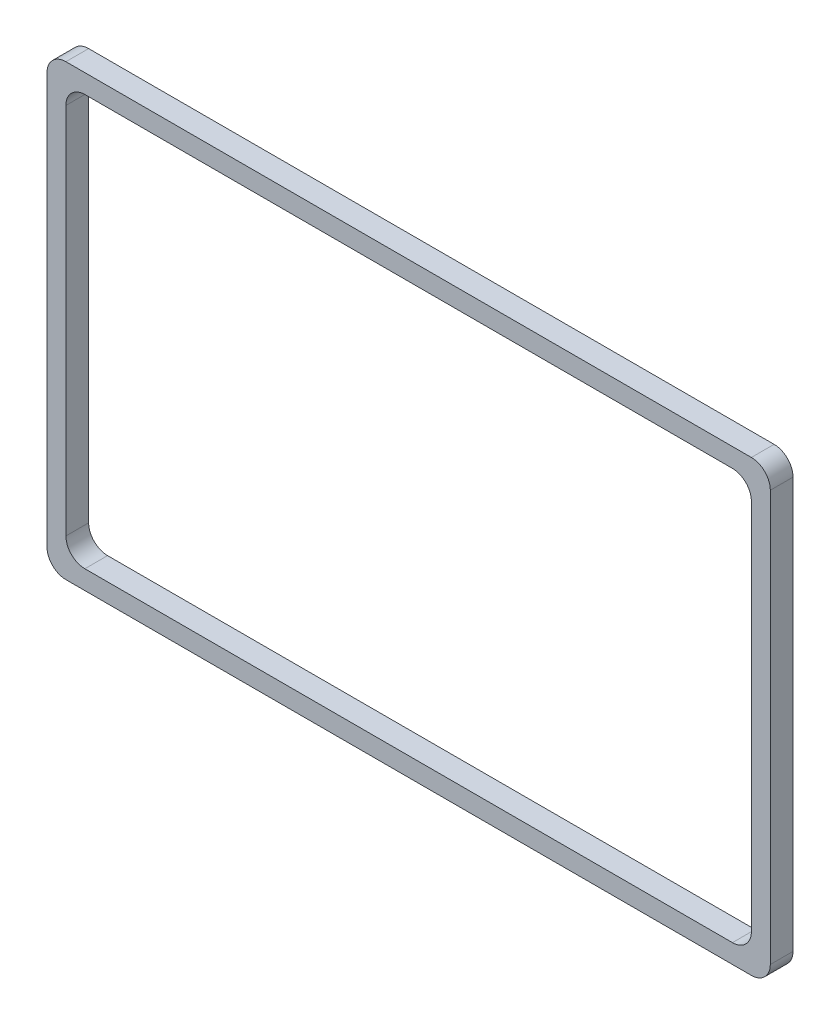
ISO-10303-21;
HEADER;
FILE_DESCRIPTION(('STEP AP214'),'2;1');
FILE_NAME('part.step','',(''),(''),'','','');
FILE_SCHEMA(('AUTOMOTIVE_DESIGN { 1 0 10303 214 1 1 1 1 }'));
ENDSEC;
DATA;
#1=APPLICATION_CONTEXT('core data for automotive mechanical design processes');
#2=APPLICATION_PROTOCOL_DEFINITION('international standard','automotive_design',2000,#1);
#3=PRODUCT_CONTEXT('',#1,'mechanical');
#4=PRODUCT('Part','Part','',(#3));
#5=PRODUCT_RELATED_PRODUCT_CATEGORY('part','',(#4));
#6=PRODUCT_DEFINITION_FORMATION('','',#4);
#7=PRODUCT_DEFINITION_CONTEXT('part definition',#1,'design');
#8=PRODUCT_DEFINITION('design','',#6,#7);
#9=PRODUCT_DEFINITION_SHAPE('','',#8);
#10=(LENGTH_UNIT() NAMED_UNIT(*) SI_UNIT(.MILLI.,.METRE.));
#11=(NAMED_UNIT(*) PLANE_ANGLE_UNIT() SI_UNIT($,.RADIAN.));
#12=(NAMED_UNIT(*) SI_UNIT($,.STERADIAN.) SOLID_ANGLE_UNIT());
#13=UNCERTAINTY_MEASURE_WITH_UNIT(LENGTH_MEASURE(1.E-05),#10,'distance_accuracy_value','');
#14=(GEOMETRIC_REPRESENTATION_CONTEXT(3) GLOBAL_UNCERTAINTY_ASSIGNED_CONTEXT((#13)) GLOBAL_UNIT_ASSIGNED_CONTEXT((#10,
#11,#12)) REPRESENTATION_CONTEXT('',''));
#15=CARTESIAN_POINT('',(0.,0.,0.));
#16=DIRECTION('',(0.,0.,1.));
#17=DIRECTION('',(1.,0.,0.));
#18=AXIS2_PLACEMENT_3D('',#15,#16,#17);
#19=CARTESIAN_POINT('',(-2.36868136389672,185.758648558505,12.));
#20=DIRECTION('',(0.,0.,1.));
#21=DIRECTION('',(1.,0.,0.));
#22=AXIS2_PLACEMENT_3D('',#19,#20,#21);
#23=PLANE('',#22);
#24=CARTESIAN_POINT('',(-2.36868136389672,185.758648558505,12.));
#25=DIRECTION('',(0.,0.,1.));
#26=DIRECTION('',(1.,0.,0.));
#27=AXIS2_PLACEMENT_3D('',#24,#25,#26);
#28=CIRCLE('',#27,10.);
#29=CARTESIAN_POINT('',(-2.36868136389673,195.758648558505,12.));
#30=VERTEX_POINT('',#29);
#31=CARTESIAN_POINT('',(-12.3686813638967,185.758648558505,12.));
#32=VERTEX_POINT('',#31);
#33=EDGE_CURVE('E242',#30,#32,#28,.T.);
#34=ORIENTED_EDGE('',*,*,#33,.T.);
#35=DIRECTION('',(0.,-1.,0.));
#36=VECTOR('',#35,1.);
#37=CARTESIAN_POINT('',(-12.3686813638967,185.758648558505,12.));
#38=LINE('',#37,#36);
#39=CARTESIAN_POINT('',(-12.3686813638967,-31.1413514414953,12.));
#40=VERTEX_POINT('',#39);
#41=EDGE_CURVE('E246',#32,#40,#38,.T.);
#42=ORIENTED_EDGE('',*,*,#41,.T.);
#43=CARTESIAN_POINT('',(-2.36868136389672,-31.1413514414953,12.));
#44=DIRECTION('',(0.,0.,1.));
#45=DIRECTION('',(1.,0.,0.));
#46=AXIS2_PLACEMENT_3D('',#43,#44,#45);
#47=CIRCLE('',#46,10.);
#48=CARTESIAN_POINT('',(-2.36868136389672,-41.1413514414953,12.));
#49=VERTEX_POINT('',#48);
#50=EDGE_CURVE('E250',#40,#49,#47,.T.);
#51=ORIENTED_EDGE('',*,*,#50,.T.);
#52=DIRECTION('',(1.,0.,0.));
#53=VECTOR('',#52,1.);
#54=CARTESIAN_POINT('',(-2.36868136389672,-41.1413514414953,12.));
#55=LINE('',#54,#53);
#56=CARTESIAN_POINT('',(359.631318636103,-41.1413514414953,12.));
#57=VERTEX_POINT('',#56);
#58=EDGE_CURVE('E253',#49,#57,#55,.T.);
#59=ORIENTED_EDGE('',*,*,#58,.T.);
#60=CARTESIAN_POINT('',(359.631318636103,-31.1413514414953,12.));
#61=DIRECTION('',(0.,0.,1.));
#62=DIRECTION('',(1.,0.,0.));
#63=AXIS2_PLACEMENT_3D('',#60,#61,#62);
#64=CIRCLE('',#63,10.);
#65=CARTESIAN_POINT('',(369.631318636103,-31.1413514414953,12.));
#66=VERTEX_POINT('',#65);
#67=EDGE_CURVE('E256',#57,#66,#64,.T.);
#68=ORIENTED_EDGE('',*,*,#67,.T.);
#69=DIRECTION('',(0.,1.,0.));
#70=VECTOR('',#69,1.);
#71=CARTESIAN_POINT('',(369.631318636103,185.758648558505,12.));
#72=LINE('',#71,#70);
#73=CARTESIAN_POINT('',(369.631318636103,185.758648558505,12.));
#74=VERTEX_POINT('',#73);
#75=EDGE_CURVE('E259',#66,#74,#72,.T.);
#76=ORIENTED_EDGE('',*,*,#75,.T.);
#77=CARTESIAN_POINT('',(359.631318636103,185.758648558505,12.));
#78=DIRECTION('',(0.,0.,1.));
#79=DIRECTION('',(-1.,0.,0.));
#80=AXIS2_PLACEMENT_3D('',#77,#78,#79);
#81=CIRCLE('',#80,10.);
#82=CARTESIAN_POINT('',(359.631318636103,195.758648558505,12.));
#83=VERTEX_POINT('',#82);
#84=EDGE_CURVE('E262',#74,#83,#81,.T.);
#85=ORIENTED_EDGE('',*,*,#84,.T.);
#86=DIRECTION('',(-1.,0.,0.));
#87=VECTOR('',#86,1.);
#88=CARTESIAN_POINT('',(-2.36868136389673,195.758648558505,12.));
#89=LINE('',#88,#87);
#90=EDGE_CURVE('E265',#83,#30,#89,.T.);
#91=ORIENTED_EDGE('',*,*,#90,.T.);
#92=EDGE_LOOP('',(#34,#42,#51,#59,#68,#76,#85,#91));
#93=FACE_BOUND('',#92,.T.);
#94=DIRECTION('',(-1.,0.,0.));
#95=VECTOR('',#94,1.);
#96=CARTESIAN_POINT('',(7.63131863610326,185.758648558505,12.));
#97=LINE('',#96,#95);
#98=CARTESIAN_POINT('',(349.631318636103,185.758648558505,12.));
#99=VERTEX_POINT('',#98);
#100=CARTESIAN_POINT('',(7.63131863610326,185.758648558505,12.));
#101=VERTEX_POINT('',#100);
#102=EDGE_CURVE('E162',#99,#101,#97,.T.);
#103=ORIENTED_EDGE('',*,*,#102,.F.);
#104=CARTESIAN_POINT('',(349.631318636103,175.758648558505,12.));
#105=DIRECTION('',(0.,0.,1.));
#106=DIRECTION('',(-1.,0.,0.));
#107=AXIS2_PLACEMENT_3D('',#104,#105,#106);
#108=CIRCLE('',#107,9.99999999999997);
#109=CARTESIAN_POINT('',(359.631318636103,175.758648558505,12.));
#110=VERTEX_POINT('',#109);
#111=EDGE_CURVE('E153',#110,#99,#108,.T.);
#112=ORIENTED_EDGE('',*,*,#111,.F.);
#113=DIRECTION('',(0.,1.,0.));
#114=VECTOR('',#113,1.);
#115=CARTESIAN_POINT('',(359.631318636103,175.758648558505,12.));
#116=LINE('',#115,#114);
#117=CARTESIAN_POINT('',(359.631318636103,-21.1413514414953,12.));
#118=VERTEX_POINT('',#117);
#119=EDGE_CURVE('E194',#118,#110,#116,.T.);
#120=ORIENTED_EDGE('',*,*,#119,.F.);
#121=CARTESIAN_POINT('',(349.631318636103,-21.1413514414953,12.));
#122=DIRECTION('',(0.,0.,1.));
#123=DIRECTION('',(1.,0.,0.));
#124=AXIS2_PLACEMENT_3D('',#121,#122,#123);
#125=CIRCLE('',#124,9.99999999999997);
#126=CARTESIAN_POINT('',(349.631318636103,-31.1413514414953,12.));
#127=VERTEX_POINT('',#126);
#128=EDGE_CURVE('E191',#127,#118,#125,.T.);
#129=ORIENTED_EDGE('',*,*,#128,.F.);
#130=DIRECTION('',(1.,0.,0.));
#131=VECTOR('',#130,1.);
#132=CARTESIAN_POINT('',(7.63131863610328,-31.1413514414953,12.));
#133=LINE('',#132,#131);
#134=CARTESIAN_POINT('',(7.63131863610327,-31.1413514414953,12.));
#135=VERTEX_POINT('',#134);
#136=EDGE_CURVE('E188',#135,#127,#133,.T.);
#137=ORIENTED_EDGE('',*,*,#136,.F.);
#138=CARTESIAN_POINT('',(7.63131863610328,-21.1413514414953,12.));
#139=DIRECTION('',(0.,0.,1.));
#140=DIRECTION('',(1.,0.,0.));
#141=AXIS2_PLACEMENT_3D('',#138,#139,#140);
#142=CIRCLE('',#141,9.99999999999999);
#143=CARTESIAN_POINT('',(-2.36868136389672,-21.1413514414953,12.));
#144=VERTEX_POINT('',#143);
#145=EDGE_CURVE('E185',#144,#135,#142,.T.);
#146=ORIENTED_EDGE('',*,*,#145,.F.);
#147=DIRECTION('',(0.,-1.,0.));
#148=VECTOR('',#147,1.);
#149=CARTESIAN_POINT('',(-2.36868136389674,175.758648558505,12.));
#150=LINE('',#149,#148);
#151=CARTESIAN_POINT('',(-2.36868136389676,175.758648558505,12.));
#152=VERTEX_POINT('',#151);
#153=EDGE_CURVE('E180',#152,#144,#150,.T.);
#154=ORIENTED_EDGE('',*,*,#153,.F.);
#155=CARTESIAN_POINT('',(7.63131863610326,175.758648558505,12.));
#156=DIRECTION('',(0.,0.,1.));
#157=DIRECTION('',(1.,0.,0.));
#158=AXIS2_PLACEMENT_3D('',#155,#156,#157);
#159=CIRCLE('',#158,10.);
#160=EDGE_CURVE('E176',#101,#152,#159,.T.);
#161=ORIENTED_EDGE('',*,*,#160,.F.);
#162=EDGE_LOOP('',(#103,#112,#120,#129,#137,#146,#154,#161));
#163=FACE_BOUND('',#162,.T.);
#164=ADVANCED_FACE('F39',(#93,#163),#23,.T.);
#165=CARTESIAN_POINT('',(-2.36868136389672,185.758648558505,0.));
#166=DIRECTION('',(0.,0.,1.));
#167=DIRECTION('',(1.,0.,0.));
#168=AXIS2_PLACEMENT_3D('',#165,#166,#167);
#169=PLANE('',#168);
#170=CARTESIAN_POINT('',(-2.36868136389672,185.758648558505,0.));
#171=DIRECTION('',(0.,0.,1.));
#172=DIRECTION('',(1.,0.,0.));
#173=AXIS2_PLACEMENT_3D('',#170,#171,#172);
#174=CIRCLE('',#173,10.);
#175=CARTESIAN_POINT('',(-2.36868136389673,195.758648558505,0.));
#176=VERTEX_POINT('',#175);
#177=CARTESIAN_POINT('',(-12.3686813638967,185.758648558505,0.));
#178=VERTEX_POINT('',#177);
#179=EDGE_CURVE('E171',#176,#178,#174,.T.);
#180=ORIENTED_EDGE('',*,*,#179,.F.);
#181=DIRECTION('',(-1.,0.,0.));
#182=VECTOR('',#181,1.);
#183=CARTESIAN_POINT('',(-2.36868136389673,195.758648558505,0.));
#184=LINE('',#183,#182);
#185=CARTESIAN_POINT('',(359.631318636103,195.758648558505,0.));
#186=VERTEX_POINT('',#185);
#187=EDGE_CURVE('E247',#186,#176,#184,.T.);
#188=ORIENTED_EDGE('',*,*,#187,.F.);
#189=CARTESIAN_POINT('',(359.631318636103,185.758648558505,0.));
#190=DIRECTION('',(0.,0.,1.));
#191=DIRECTION('',(-1.,0.,0.));
#192=AXIS2_PLACEMENT_3D('',#189,#190,#191);
#193=CIRCLE('',#192,10.);
#194=CARTESIAN_POINT('',(369.631318636103,185.758648558505,0.));
#195=VERTEX_POINT('',#194);
#196=EDGE_CURVE('E287',#195,#186,#193,.T.);
#197=ORIENTED_EDGE('',*,*,#196,.F.);
#198=DIRECTION('',(0.,1.,0.));
#199=VECTOR('',#198,1.);
#200=CARTESIAN_POINT('',(369.631318636103,185.758648558505,0.));
#201=LINE('',#200,#199);
#202=CARTESIAN_POINT('',(369.631318636103,-31.1413514414953,0.));
#203=VERTEX_POINT('',#202);
#204=EDGE_CURVE('E284',#203,#195,#201,.T.);
#205=ORIENTED_EDGE('',*,*,#204,.F.);
#206=CARTESIAN_POINT('',(359.631318636103,-31.1413514414953,0.));
#207=DIRECTION('',(0.,0.,1.));
#208=DIRECTION('',(1.,0.,0.));
#209=AXIS2_PLACEMENT_3D('',#206,#207,#208);
#210=CIRCLE('',#209,10.);
#211=CARTESIAN_POINT('',(359.631318636103,-41.1413514414953,0.));
#212=VERTEX_POINT('',#211);
#213=EDGE_CURVE('E281',#212,#203,#210,.T.);
#214=ORIENTED_EDGE('',*,*,#213,.F.);
#215=DIRECTION('',(1.,0.,0.));
#216=VECTOR('',#215,1.);
#217=CARTESIAN_POINT('',(-2.36868136389672,-41.1413514414953,0.));
#218=LINE('',#217,#216);
#219=CARTESIAN_POINT('',(-2.36868136389672,-41.1413514414953,0.));
#220=VERTEX_POINT('',#219);
#221=EDGE_CURVE('E278',#220,#212,#218,.T.);
#222=ORIENTED_EDGE('',*,*,#221,.F.);
#223=CARTESIAN_POINT('',(-2.36868136389672,-31.1413514414953,0.));
#224=DIRECTION('',(0.,0.,1.));
#225=DIRECTION('',(1.,0.,0.));
#226=AXIS2_PLACEMENT_3D('',#223,#224,#225);
#227=CIRCLE('',#226,10.);
#228=CARTESIAN_POINT('',(-12.3686813638967,-31.1413514414953,0.));
#229=VERTEX_POINT('',#228);
#230=EDGE_CURVE('E275',#229,#220,#227,.T.);
#231=ORIENTED_EDGE('',*,*,#230,.F.);
#232=DIRECTION('',(0.,-1.,0.));
#233=VECTOR('',#232,1.);
#234=CARTESIAN_POINT('',(-12.3686813638967,185.758648558505,0.));
#235=LINE('',#234,#233);
#236=EDGE_CURVE('E272',#178,#229,#235,.T.);
#237=ORIENTED_EDGE('',*,*,#236,.F.);
#238=EDGE_LOOP('',(#180,#188,#197,#205,#214,#222,#231,#237));
#239=FACE_BOUND('',#238,.T.);
#240=CARTESIAN_POINT('',(349.631318636103,175.758648558505,0.));
#241=DIRECTION('',(0.,0.,1.));
#242=DIRECTION('',(-1.,0.,0.));
#243=AXIS2_PLACEMENT_3D('',#240,#241,#242);
#244=CIRCLE('',#243,9.99999999999997);
#245=CARTESIAN_POINT('',(359.631318636103,175.758648558505,0.));
#246=VERTEX_POINT('',#245);
#247=CARTESIAN_POINT('',(349.631318636103,185.758648558505,0.));
#248=VERTEX_POINT('',#247);
#249=EDGE_CURVE('E63',#246,#248,#244,.T.);
#250=ORIENTED_EDGE('',*,*,#249,.T.);
#251=DIRECTION('',(-1.,0.,0.));
#252=VECTOR('',#251,1.);
#253=CARTESIAN_POINT('',(7.63131863610326,185.758648558505,0.));
#254=LINE('',#253,#252);
#255=CARTESIAN_POINT('',(7.63131863610326,185.758648558505,0.));
#256=VERTEX_POINT('',#255);
#257=EDGE_CURVE('E169',#248,#256,#254,.T.);
#258=ORIENTED_EDGE('',*,*,#257,.T.);
#259=CARTESIAN_POINT('',(7.63131863610326,175.758648558505,0.));
#260=DIRECTION('',(0.,0.,1.));
#261=DIRECTION('',(1.,0.,0.));
#262=AXIS2_PLACEMENT_3D('',#259,#260,#261);
#263=CIRCLE('',#262,10.);
#264=CARTESIAN_POINT('',(-2.36868136389676,175.758648558505,0.));
#265=VERTEX_POINT('',#264);
#266=EDGE_CURVE('E201',#256,#265,#263,.T.);
#267=ORIENTED_EDGE('',*,*,#266,.T.);
#268=DIRECTION('',(0.,-1.,0.));
#269=VECTOR('',#268,1.);
#270=CARTESIAN_POINT('',(-2.36868136389674,175.758648558505,0.));
#271=LINE('',#270,#269);
#272=CARTESIAN_POINT('',(-2.36868136389672,-21.1413514414953,0.));
#273=VERTEX_POINT('',#272);
#274=EDGE_CURVE('E205',#265,#273,#271,.T.);
#275=ORIENTED_EDGE('',*,*,#274,.T.);
#276=CARTESIAN_POINT('',(7.63131863610328,-21.1413514414953,0.));
#277=DIRECTION('',(0.,0.,1.));
#278=DIRECTION('',(1.,0.,0.));
#279=AXIS2_PLACEMENT_3D('',#276,#277,#278);
#280=CIRCLE('',#279,9.99999999999999);
#281=CARTESIAN_POINT('',(7.63131863610327,-31.1413514414953,0.));
#282=VERTEX_POINT('',#281);
#283=EDGE_CURVE('E209',#273,#282,#280,.T.);
#284=ORIENTED_EDGE('',*,*,#283,.T.);
#285=DIRECTION('',(1.,0.,0.));
#286=VECTOR('',#285,1.);
#287=CARTESIAN_POINT('',(7.63131863610328,-31.1413514414953,0.));
#288=LINE('',#287,#286);
#289=CARTESIAN_POINT('',(349.631318636103,-31.1413514414953,0.));
#290=VERTEX_POINT('',#289);
#291=EDGE_CURVE('E213',#282,#290,#288,.T.);
#292=ORIENTED_EDGE('',*,*,#291,.T.);
#293=CARTESIAN_POINT('',(349.631318636103,-21.1413514414953,0.));
#294=DIRECTION('',(0.,0.,1.));
#295=DIRECTION('',(1.,0.,0.));
#296=AXIS2_PLACEMENT_3D('',#293,#294,#295);
#297=CIRCLE('',#296,9.99999999999997);
#298=CARTESIAN_POINT('',(359.631318636103,-21.1413514414953,0.));
#299=VERTEX_POINT('',#298);
#300=EDGE_CURVE('E217',#290,#299,#297,.T.);
#301=ORIENTED_EDGE('',*,*,#300,.T.);
#302=DIRECTION('',(0.,1.,0.));
#303=VECTOR('',#302,1.);
#304=CARTESIAN_POINT('',(359.631318636103,175.758648558505,0.));
#305=LINE('',#304,#303);
#306=EDGE_CURVE('E163',#299,#246,#305,.T.);
#307=ORIENTED_EDGE('',*,*,#306,.T.);
#308=EDGE_LOOP('',(#250,#258,#267,#275,#284,#292,#301,#307));
#309=FACE_BOUND('',#308,.T.);
#310=ADVANCED_FACE('F326',(#239,#309),#169,.F.);
#311=CARTESIAN_POINT('',(-2.36868136389672,185.758648558505,12.));
#312=DIRECTION('',(0.,0.,-1.));
#313=DIRECTION('',(-1.,0.,0.));
#314=AXIS2_PLACEMENT_3D('',#311,#312,#313);
#315=CYLINDRICAL_SURFACE('',#314,10.);
#316=ORIENTED_EDGE('',*,*,#179,.T.);
#317=DIRECTION('',(0.,0.,-1.));
#318=VECTOR('',#317,1.);
#319=CARTESIAN_POINT('',(-12.3686813638967,185.758648558505,12.));
#320=LINE('',#319,#318);
#321=EDGE_CURVE('E11',#32,#178,#320,.T.);
#322=ORIENTED_EDGE('',*,*,#321,.F.);
#323=ORIENTED_EDGE('',*,*,#33,.F.);
#324=DIRECTION('',(0.,0.,-1.));
#325=VECTOR('',#324,1.);
#326=CARTESIAN_POINT('',(-2.36868136389673,195.758648558505,12.));
#327=LINE('',#326,#325);
#328=EDGE_CURVE('E268',#30,#176,#327,.T.);
#329=ORIENTED_EDGE('',*,*,#328,.T.);
#330=EDGE_LOOP('',(#316,#322,#323,#329));
#331=FACE_BOUND('',#330,.T.);
#332=ADVANCED_FACE('F41',(#331),#315,.T.);
#333=CARTESIAN_POINT('',(-12.3686813638967,185.758648558505,12.));
#334=DIRECTION('',(1.,0.,0.));
#335=DIRECTION('',(0.,1.,0.));
#336=AXIS2_PLACEMENT_3D('',#333,#334,#335);
#337=PLANE('',#336);
#338=ORIENTED_EDGE('',*,*,#236,.T.);
#339=DIRECTION('',(0.,0.,-1.));
#340=VECTOR('',#339,1.);
#341=CARTESIAN_POINT('',(-12.3686813638967,-31.1413514414953,12.));
#342=LINE('',#341,#340);
#343=EDGE_CURVE('E48',#40,#229,#342,.T.);
#344=ORIENTED_EDGE('',*,*,#343,.F.);
#345=ORIENTED_EDGE('',*,*,#41,.F.);
#346=ORIENTED_EDGE('',*,*,#321,.T.);
#347=EDGE_LOOP('',(#338,#344,#345,#346));
#348=FACE_BOUND('',#347,.T.);
#349=ADVANCED_FACE('F343',(#348),#337,.F.);
#350=CARTESIAN_POINT('',(-2.36868136389672,-31.1413514414953,12.));
#351=DIRECTION('',(0.,0.,-1.));
#352=DIRECTION('',(-1.,0.,0.));
#353=AXIS2_PLACEMENT_3D('',#350,#351,#352);
#354=CYLINDRICAL_SURFACE('',#353,10.);
#355=ORIENTED_EDGE('',*,*,#230,.T.);
#356=DIRECTION('',(0.,0.,-1.));
#357=VECTOR('',#356,1.);
#358=CARTESIAN_POINT('',(-2.36868136389672,-41.1413514414953,12.));
#359=LINE('',#358,#357);
#360=EDGE_CURVE('E311',#49,#220,#359,.T.);
#361=ORIENTED_EDGE('',*,*,#360,.F.);
#362=ORIENTED_EDGE('',*,*,#50,.F.);
#363=ORIENTED_EDGE('',*,*,#343,.T.);
#364=EDGE_LOOP('',(#355,#361,#362,#363));
#365=FACE_BOUND('',#364,.T.);
#366=ADVANCED_FACE('F320',(#365),#354,.T.);
#367=CARTESIAN_POINT('',(-2.36868136389672,-41.1413514414953,12.));
#368=DIRECTION('',(0.,1.,0.));
#369=DIRECTION('',(-1.,0.,0.));
#370=AXIS2_PLACEMENT_3D('',#367,#368,#369);
#371=PLANE('',#370);
#372=ORIENTED_EDGE('',*,*,#221,.T.);
#373=DIRECTION('',(0.,0.,-1.));
#374=VECTOR('',#373,1.);
#375=CARTESIAN_POINT('',(359.631318636103,-41.1413514414953,12.));
#376=LINE('',#375,#374);
#377=EDGE_CURVE('E307',#57,#212,#376,.T.);
#378=ORIENTED_EDGE('',*,*,#377,.F.);
#379=ORIENTED_EDGE('',*,*,#58,.F.);
#380=ORIENTED_EDGE('',*,*,#360,.T.);
#381=EDGE_LOOP('',(#372,#378,#379,#380));
#382=FACE_BOUND('',#381,.T.);
#383=ADVANCED_FACE('F332',(#382),#371,.F.);
#384=CARTESIAN_POINT('',(359.631318636103,-31.1413514414953,12.));
#385=DIRECTION('',(0.,0.,-1.));
#386=DIRECTION('',(-1.,0.,0.));
#387=AXIS2_PLACEMENT_3D('',#384,#385,#386);
#388=CYLINDRICAL_SURFACE('',#387,10.);
#389=ORIENTED_EDGE('',*,*,#213,.T.);
#390=DIRECTION('',(0.,0.,-1.));
#391=VECTOR('',#390,1.);
#392=CARTESIAN_POINT('',(369.631318636103,-31.1413514414953,12.));
#393=LINE('',#392,#391);
#394=EDGE_CURVE('E303',#66,#203,#393,.T.);
#395=ORIENTED_EDGE('',*,*,#394,.F.);
#396=ORIENTED_EDGE('',*,*,#67,.F.);
#397=ORIENTED_EDGE('',*,*,#377,.T.);
#398=EDGE_LOOP('',(#389,#395,#396,#397));
#399=FACE_BOUND('',#398,.T.);
#400=ADVANCED_FACE('F336',(#399),#388,.T.);
#401=CARTESIAN_POINT('',(369.631318636103,185.758648558505,12.));
#402=DIRECTION('',(-1.,0.,0.));
#403=DIRECTION('',(0.,-1.,0.));
#404=AXIS2_PLACEMENT_3D('',#401,#402,#403);
#405=PLANE('',#404);
#406=ORIENTED_EDGE('',*,*,#204,.T.);
#407=DIRECTION('',(0.,0.,-1.));
#408=VECTOR('',#407,1.);
#409=CARTESIAN_POINT('',(369.631318636103,185.758648558505,12.));
#410=LINE('',#409,#408);
#411=EDGE_CURVE('E299',#74,#195,#410,.T.);
#412=ORIENTED_EDGE('',*,*,#411,.F.);
#413=ORIENTED_EDGE('',*,*,#75,.F.);
#414=ORIENTED_EDGE('',*,*,#394,.T.);
#415=EDGE_LOOP('',(#406,#412,#413,#414));
#416=FACE_BOUND('',#415,.T.);
#417=ADVANCED_FACE('F356',(#416),#405,.F.);
#418=CARTESIAN_POINT('',(359.631318636103,185.758648558505,12.));
#419=DIRECTION('',(0.,0.,-1.));
#420=DIRECTION('',(-1.,0.,0.));
#421=AXIS2_PLACEMENT_3D('',#418,#419,#420);
#422=CYLINDRICAL_SURFACE('',#421,10.);
#423=ORIENTED_EDGE('',*,*,#196,.T.);
#424=DIRECTION('',(0.,0.,-1.));
#425=VECTOR('',#424,1.);
#426=CARTESIAN_POINT('',(359.631318636103,195.758648558505,12.));
#427=LINE('',#426,#425);
#428=EDGE_CURVE('E295',#83,#186,#427,.T.);
#429=ORIENTED_EDGE('',*,*,#428,.F.);
#430=ORIENTED_EDGE('',*,*,#84,.F.);
#431=ORIENTED_EDGE('',*,*,#411,.T.);
#432=EDGE_LOOP('',(#423,#429,#430,#431));
#433=FACE_BOUND('',#432,.T.);
#434=ADVANCED_FACE('F354',(#433),#422,.T.);
#435=CARTESIAN_POINT('',(-2.36868136389673,195.758648558505,12.));
#436=DIRECTION('',(0.,-1.,0.));
#437=DIRECTION('',(0.,0.,-1.));
#438=AXIS2_PLACEMENT_3D('',#435,#436,#437);
#439=PLANE('',#438);
#440=ORIENTED_EDGE('',*,*,#187,.T.);
#441=ORIENTED_EDGE('',*,*,#328,.F.);
#442=ORIENTED_EDGE('',*,*,#90,.F.);
#443=ORIENTED_EDGE('',*,*,#428,.T.);
#444=EDGE_LOOP('',(#440,#441,#442,#443));
#445=FACE_BOUND('',#444,.T.);
#446=ADVANCED_FACE('F349',(#445),#439,.F.);
#447=CARTESIAN_POINT('',(349.631318636103,175.758648558505,12.));
#448=DIRECTION('',(0.,0.,-1.));
#449=DIRECTION('',(-1.,0.,0.));
#450=AXIS2_PLACEMENT_3D('',#447,#448,#449);
#451=CYLINDRICAL_SURFACE('',#450,9.99999999999997);
#452=ORIENTED_EDGE('',*,*,#249,.F.);
#453=DIRECTION('',(0.,0.,-1.));
#454=VECTOR('',#453,1.);
#455=CARTESIAN_POINT('',(359.631318636103,175.758648558505,12.));
#456=LINE('',#455,#454);
#457=EDGE_CURVE('E157',#110,#246,#456,.T.);
#458=ORIENTED_EDGE('',*,*,#457,.F.);
#459=ORIENTED_EDGE('',*,*,#111,.T.);
#460=DIRECTION('',(0.,0.,-1.));
#461=VECTOR('',#460,1.);
#462=CARTESIAN_POINT('',(349.631318636103,185.758648558505,12.));
#463=LINE('',#462,#461);
#464=EDGE_CURVE('E156',#99,#248,#463,.T.);
#465=ORIENTED_EDGE('',*,*,#464,.T.);
#466=EDGE_LOOP('',(#452,#458,#459,#465));
#467=FACE_BOUND('',#466,.T.);
#468=ADVANCED_FACE('F155',(#467),#451,.F.);
#469=CARTESIAN_POINT('',(7.63131863610326,185.758648558505,12.));
#470=DIRECTION('',(0.,-1.,0.));
#471=DIRECTION('',(1.,0.,0.));
#472=AXIS2_PLACEMENT_3D('',#469,#470,#471);
#473=PLANE('',#472);
#474=ORIENTED_EDGE('',*,*,#257,.F.);
#475=ORIENTED_EDGE('',*,*,#464,.F.);
#476=ORIENTED_EDGE('',*,*,#102,.T.);
#477=DIRECTION('',(0.,0.,-1.));
#478=VECTOR('',#477,1.);
#479=CARTESIAN_POINT('',(7.63131863610326,185.758648558505,12.));
#480=LINE('',#479,#478);
#481=EDGE_CURVE('E172',#101,#256,#480,.T.);
#482=ORIENTED_EDGE('',*,*,#481,.T.);
#483=EDGE_LOOP('',(#474,#475,#476,#482));
#484=FACE_BOUND('',#483,.T.);
#485=ADVANCED_FACE('F166',(#484),#473,.T.);
#486=CARTESIAN_POINT('',(7.63131863610326,175.758648558505,12.));
#487=DIRECTION('',(0.,0.,-1.));
#488=DIRECTION('',(-1.,0.,0.));
#489=AXIS2_PLACEMENT_3D('',#486,#487,#488);
#490=CYLINDRICAL_SURFACE('',#489,10.);
#491=ORIENTED_EDGE('',*,*,#266,.F.);
#492=ORIENTED_EDGE('',*,*,#481,.F.);
#493=ORIENTED_EDGE('',*,*,#160,.T.);
#494=DIRECTION('',(0.,0.,-1.));
#495=VECTOR('',#494,1.);
#496=CARTESIAN_POINT('',(-2.36868136389676,175.758648558505,12.));
#497=LINE('',#496,#495);
#498=EDGE_CURVE('E237',#152,#265,#497,.T.);
#499=ORIENTED_EDGE('',*,*,#498,.T.);
#500=EDGE_LOOP('',(#491,#492,#493,#499));
#501=FACE_BOUND('',#500,.T.);
#502=ADVANCED_FACE('F381',(#501),#490,.F.);
#503=CARTESIAN_POINT('',(-2.36868136389674,175.758648558505,12.));
#504=DIRECTION('',(1.,0.,0.));
#505=DIRECTION('',(0.,1.,0.));
#506=AXIS2_PLACEMENT_3D('',#503,#504,#505);
#507=PLANE('',#506);
#508=ORIENTED_EDGE('',*,*,#274,.F.);
#509=ORIENTED_EDGE('',*,*,#498,.F.);
#510=ORIENTED_EDGE('',*,*,#153,.T.);
#511=DIRECTION('',(0.,0.,-1.));
#512=VECTOR('',#511,1.);
#513=CARTESIAN_POINT('',(-2.36868136389672,-21.1413514414953,12.));
#514=LINE('',#513,#512);
#515=EDGE_CURVE('E234',#144,#273,#514,.T.);
#516=ORIENTED_EDGE('',*,*,#515,.T.);
#517=EDGE_LOOP('',(#508,#509,#510,#516));
#518=FACE_BOUND('',#517,.T.);
#519=ADVANCED_FACE('F385',(#518),#507,.T.);
#520=CARTESIAN_POINT('',(7.63131863610328,-21.1413514414953,12.));
#521=DIRECTION('',(0.,0.,-1.));
#522=DIRECTION('',(-1.,0.,0.));
#523=AXIS2_PLACEMENT_3D('',#520,#521,#522);
#524=CYLINDRICAL_SURFACE('',#523,9.99999999999999);
#525=ORIENTED_EDGE('',*,*,#283,.F.);
#526=ORIENTED_EDGE('',*,*,#515,.F.);
#527=ORIENTED_EDGE('',*,*,#145,.T.);
#528=DIRECTION('',(0.,0.,-1.));
#529=VECTOR('',#528,1.);
#530=CARTESIAN_POINT('',(7.63131863610327,-31.1413514414953,12.));
#531=LINE('',#530,#529);
#532=EDGE_CURVE('E231',#135,#282,#531,.T.);
#533=ORIENTED_EDGE('',*,*,#532,.T.);
#534=EDGE_LOOP('',(#525,#526,#527,#533));
#535=FACE_BOUND('',#534,.T.);
#536=ADVANCED_FACE('F391',(#535),#524,.F.);
#537=CARTESIAN_POINT('',(7.63131863610328,-31.1413514414953,12.));
#538=DIRECTION('',(0.,1.,0.));
#539=DIRECTION('',(-1.,0.,0.));
#540=AXIS2_PLACEMENT_3D('',#537,#538,#539);
#541=PLANE('',#540);
#542=ORIENTED_EDGE('',*,*,#291,.F.);
#543=ORIENTED_EDGE('',*,*,#532,.F.);
#544=ORIENTED_EDGE('',*,*,#136,.T.);
#545=DIRECTION('',(0.,0.,-1.));
#546=VECTOR('',#545,1.);
#547=CARTESIAN_POINT('',(349.631318636103,-31.1413514414953,12.));
#548=LINE('',#547,#546);
#549=EDGE_CURVE('E228',#127,#290,#548,.T.);
#550=ORIENTED_EDGE('',*,*,#549,.T.);
#551=EDGE_LOOP('',(#542,#543,#544,#550));
#552=FACE_BOUND('',#551,.T.);
#553=ADVANCED_FACE('F395',(#552),#541,.T.);
#554=CARTESIAN_POINT('',(349.631318636103,-21.1413514414953,12.));
#555=DIRECTION('',(0.,0.,-1.));
#556=DIRECTION('',(-1.,0.,0.));
#557=AXIS2_PLACEMENT_3D('',#554,#555,#556);
#558=CYLINDRICAL_SURFACE('',#557,9.99999999999997);
#559=ORIENTED_EDGE('',*,*,#300,.F.);
#560=ORIENTED_EDGE('',*,*,#549,.F.);
#561=ORIENTED_EDGE('',*,*,#128,.T.);
#562=DIRECTION('',(0.,0.,-1.));
#563=VECTOR('',#562,1.);
#564=CARTESIAN_POINT('',(359.631318636103,-21.1413514414953,12.));
#565=LINE('',#564,#563);
#566=EDGE_CURVE('E55',#118,#299,#565,.T.);
#567=ORIENTED_EDGE('',*,*,#566,.T.);
#568=EDGE_LOOP('',(#559,#560,#561,#567));
#569=FACE_BOUND('',#568,.T.);
#570=ADVANCED_FACE('F399',(#569),#558,.F.);
#571=CARTESIAN_POINT('',(359.631318636103,175.758648558505,12.));
#572=DIRECTION('',(-1.,0.,0.));
#573=DIRECTION('',(0.,0.,1.));
#574=AXIS2_PLACEMENT_3D('',#571,#572,#573);
#575=PLANE('',#574);
#576=ORIENTED_EDGE('',*,*,#306,.F.);
#577=ORIENTED_EDGE('',*,*,#566,.F.);
#578=ORIENTED_EDGE('',*,*,#119,.T.);
#579=ORIENTED_EDGE('',*,*,#457,.T.);
#580=EDGE_LOOP('',(#576,#577,#578,#579));
#581=FACE_BOUND('',#580,.T.);
#582=ADVANCED_FACE('F403',(#581),#575,.T.);
#583=CLOSED_SHELL('',(#164,#310,#332,#349,#366,#383,#400,#417,#434,#446,#468,#485,#502,#519,
#536,#553,#570,#582));
#584=MANIFOLD_SOLID_BREP('B2',#583);
#585=ADVANCED_BREP_SHAPE_REPRESENTATION('',(#18,#584),#14);
#586=SHAPE_DEFINITION_REPRESENTATION(#9,#585);
ENDSEC;
END-ISO-10303-21;
